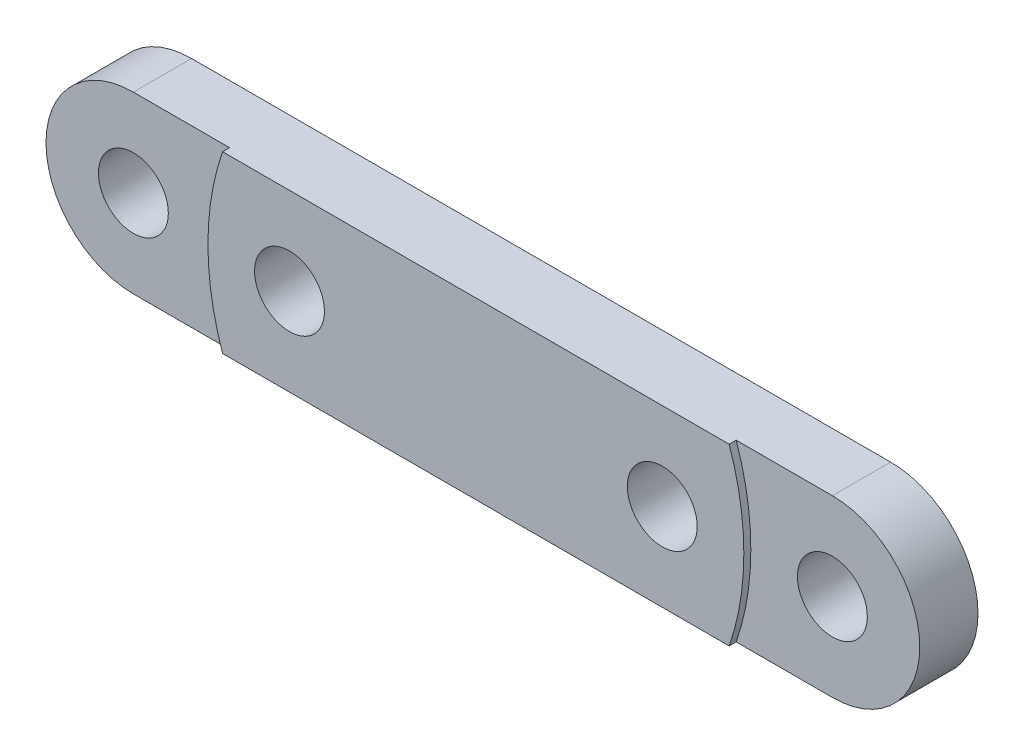
ISO-10303-21;
HEADER;
FILE_DESCRIPTION(('STEP AP214'),'2;1');
FILE_NAME('part.step','',(''),(''),'','','');
FILE_SCHEMA(('AUTOMOTIVE_DESIGN { 1 0 10303 214 1 1 1 1 }'));
ENDSEC;
DATA;
#1=APPLICATION_CONTEXT('core data for automotive mechanical design processes');
#2=APPLICATION_PROTOCOL_DEFINITION('international standard','automotive_design',2000,#1);
#3=PRODUCT_CONTEXT('',#1,'mechanical');
#4=PRODUCT('Part','Part','',(#3));
#5=PRODUCT_RELATED_PRODUCT_CATEGORY('part','',(#4));
#6=PRODUCT_DEFINITION_FORMATION('','',#4);
#7=PRODUCT_DEFINITION_CONTEXT('part definition',#1,'design');
#8=PRODUCT_DEFINITION('design','',#6,#7);
#9=PRODUCT_DEFINITION_SHAPE('','',#8);
#10=(LENGTH_UNIT() NAMED_UNIT(*) SI_UNIT(.MILLI.,.METRE.));
#11=(NAMED_UNIT(*) PLANE_ANGLE_UNIT() SI_UNIT($,.RADIAN.));
#12=(NAMED_UNIT(*) SI_UNIT($,.STERADIAN.) SOLID_ANGLE_UNIT());
#13=UNCERTAINTY_MEASURE_WITH_UNIT(LENGTH_MEASURE(1.E-05),#10,'distance_accuracy_value','');
#14=(GEOMETRIC_REPRESENTATION_CONTEXT(3) GLOBAL_UNCERTAINTY_ASSIGNED_CONTEXT((#13)) GLOBAL_UNIT_ASSIGNED_CONTEXT((#10,
#11,#12)) REPRESENTATION_CONTEXT('',''));
#15=CARTESIAN_POINT('',(0.,0.,0.));
#16=DIRECTION('',(0.,0.,1.));
#17=DIRECTION('',(1.,0.,0.));
#18=AXIS2_PLACEMENT_3D('',#15,#16,#17);
#19=CARTESIAN_POINT('',(-15.,0.,2.5));
#20=DIRECTION('',(0.,0.,1.));
#21=DIRECTION('',(1.,0.,0.));
#22=AXIS2_PLACEMENT_3D('',#19,#20,#21);
#23=PLANE('',#22);
#24=CARTESIAN_POINT('',(0.,0.,2.5));
#25=DIRECTION('',(0.,0.,1.));
#26=DIRECTION('',(1.,0.,0.));
#27=AXIS2_PLACEMENT_3D('',#24,#25,#26);
#28=CIRCLE('',#27,11.5);
#29=CARTESIAN_POINT('',(-10.8714074525794,3.75000000000014,2.5));
#30=VERTEX_POINT('',#29);
#31=CARTESIAN_POINT('',(-10.8714074525794,-3.75000000000014,2.5));
#32=VERTEX_POINT('',#31);
#33=EDGE_CURVE('E50',#30,#32,#28,.T.);
#34=ORIENTED_EDGE('',*,*,#33,.F.);
#35=DIRECTION('',(-1.,0.,0.));
#36=VECTOR('',#35,1.);
#37=CARTESIAN_POINT('',(-15.0000000000002,3.75000000000014,2.5));
#38=LINE('',#37,#36);
#39=CARTESIAN_POINT('',(-15.0000000000002,3.75000000000014,2.5));
#40=VERTEX_POINT('',#39);
#41=EDGE_CURVE('E155',#30,#40,#38,.T.);
#42=ORIENTED_EDGE('',*,*,#41,.T.);
#43=CARTESIAN_POINT('',(-15.,0.,2.5));
#44=DIRECTION('',(0.,0.,1.));
#45=DIRECTION('',(1.,0.,0.));
#46=AXIS2_PLACEMENT_3D('',#43,#44,#45);
#47=CIRCLE('',#46,3.75000000000014);
#48=CARTESIAN_POINT('',(-15.0000000000002,-3.75000000000014,2.5));
#49=VERTEX_POINT('',#48);
#50=EDGE_CURVE('E146',#40,#49,#47,.T.);
#51=ORIENTED_EDGE('',*,*,#50,.T.);
#52=DIRECTION('',(1.,0.,0.));
#53=VECTOR('',#52,1.);
#54=CARTESIAN_POINT('',(-15.0000000000002,-3.75000000000014,2.5));
#55=LINE('',#54,#53);
#56=EDGE_CURVE('E151',#49,#32,#55,.T.);
#57=ORIENTED_EDGE('',*,*,#56,.T.);
#58=EDGE_LOOP('',(#34,#42,#51,#57));
#59=FACE_BOUND('',#58,.T.);
#60=CARTESIAN_POINT('',(-15.,0.,2.5));
#61=DIRECTION('',(0.,0.,1.));
#62=DIRECTION('',(1.,0.,0.));
#63=AXIS2_PLACEMENT_3D('',#60,#61,#62);
#64=CIRCLE('',#63,1.5);
#65=CARTESIAN_POINT('',(-13.5,0.,2.5));
#66=VERTEX_POINT('',#65);
#67=EDGE_CURVE('E140',#66,#66,#64,.T.);
#68=ORIENTED_EDGE('',*,*,#67,.F.);
#69=EDGE_LOOP('',(#68));
#70=FACE_BOUND('',#69,.T.);
#71=ADVANCED_FACE('F35',(#59,#70),#23,.T.);
#72=CARTESIAN_POINT('',(0.,0.,2.5));
#73=DIRECTION('',(0.,0.,1.));
#74=DIRECTION('',(1.,0.,0.));
#75=AXIS2_PLACEMENT_3D('',#72,#73,#74);
#76=CIRCLE('',#75,11.5);
#77=CARTESIAN_POINT('',(10.8714074525794,-3.75000000000014,2.5));
#78=VERTEX_POINT('',#77);
#79=CARTESIAN_POINT('',(10.8714074525794,3.75000000000014,2.5));
#80=VERTEX_POINT('',#79);
#81=EDGE_CURVE('E58',#78,#80,#76,.T.);
#82=ORIENTED_EDGE('',*,*,#81,.F.);
#83=CARTESIAN_POINT('',(14.9999999999998,-3.75000000000014,2.5));
#84=VERTEX_POINT('',#83);
#85=EDGE_CURVE('E149',#78,#84,#55,.T.);
#86=ORIENTED_EDGE('',*,*,#85,.T.);
#87=CARTESIAN_POINT('',(15.,0.,2.5));
#88=DIRECTION('',(0.,0.,1.));
#89=DIRECTION('',(1.,0.,0.));
#90=AXIS2_PLACEMENT_3D('',#87,#88,#89);
#91=CIRCLE('',#90,3.75000000000014);
#92=CARTESIAN_POINT('',(14.9999999999998,3.75000000000014,2.5));
#93=VERTEX_POINT('',#92);
#94=EDGE_CURVE('E153',#84,#93,#91,.T.);
#95=ORIENTED_EDGE('',*,*,#94,.T.);
#96=EDGE_CURVE('E156',#93,#80,#38,.T.);
#97=ORIENTED_EDGE('',*,*,#96,.T.);
#98=EDGE_LOOP('',(#82,#86,#95,#97));
#99=FACE_BOUND('',#98,.T.);
#100=CARTESIAN_POINT('',(15.,0.,2.5));
#101=DIRECTION('',(0.,0.,1.));
#102=DIRECTION('',(1.,0.,0.));
#103=AXIS2_PLACEMENT_3D('',#100,#101,#102);
#104=CIRCLE('',#103,1.5);
#105=CARTESIAN_POINT('',(16.5,0.,2.5));
#106=VERTEX_POINT('',#105);
#107=EDGE_CURVE('E134',#106,#106,#104,.T.);
#108=ORIENTED_EDGE('',*,*,#107,.F.);
#109=EDGE_LOOP('',(#108));
#110=FACE_BOUND('',#109,.T.);
#111=ADVANCED_FACE('F206',(#99,#110),#23,.T.);
#112=CARTESIAN_POINT('',(-15.,0.,0.));
#113=DIRECTION('',(0.,0.,1.));
#114=DIRECTION('',(1.,0.,0.));
#115=AXIS2_PLACEMENT_3D('',#112,#113,#114);
#116=PLANE('',#115);
#117=CARTESIAN_POINT('',(-15.,0.,0.));
#118=DIRECTION('',(0.,0.,1.));
#119=DIRECTION('',(1.,0.,0.));
#120=AXIS2_PLACEMENT_3D('',#117,#118,#119);
#121=CIRCLE('',#120,3.75000000000014);
#122=CARTESIAN_POINT('',(-15.0000000000002,3.75000000000014,0.));
#123=VERTEX_POINT('',#122);
#124=CARTESIAN_POINT('',(-15.0000000000002,-3.75000000000014,0.));
#125=VERTEX_POINT('',#124);
#126=EDGE_CURVE('E143',#123,#125,#121,.T.);
#127=ORIENTED_EDGE('',*,*,#126,.F.);
#128=DIRECTION('',(-1.,0.,0.));
#129=VECTOR('',#128,1.);
#130=CARTESIAN_POINT('',(-15.0000000000002,3.75000000000014,0.));
#131=LINE('',#130,#129);
#132=CARTESIAN_POINT('',(14.9999999999998,3.75000000000014,0.));
#133=VERTEX_POINT('',#132);
#134=EDGE_CURVE('E150',#133,#123,#131,.T.);
#135=ORIENTED_EDGE('',*,*,#134,.F.);
#136=CARTESIAN_POINT('',(15.,0.,0.));
#137=DIRECTION('',(0.,0.,1.));
#138=DIRECTION('',(1.,0.,0.));
#139=AXIS2_PLACEMENT_3D('',#136,#137,#138);
#140=CIRCLE('',#139,3.75000000000014);
#141=CARTESIAN_POINT('',(14.9999999999998,-3.75000000000014,0.));
#142=VERTEX_POINT('',#141);
#143=EDGE_CURVE('E163',#142,#133,#140,.T.);
#144=ORIENTED_EDGE('',*,*,#143,.F.);
#145=DIRECTION('',(1.,0.,0.));
#146=VECTOR('',#145,1.);
#147=CARTESIAN_POINT('',(-15.0000000000002,-3.75000000000014,0.));
#148=LINE('',#147,#146);
#149=EDGE_CURVE('E161',#125,#142,#148,.T.);
#150=ORIENTED_EDGE('',*,*,#149,.F.);
#151=EDGE_LOOP('',(#127,#135,#144,#150));
#152=FACE_BOUND('',#151,.T.);
#153=CARTESIAN_POINT('',(-15.,0.,0.));
#154=DIRECTION('',(0.,0.,1.));
#155=DIRECTION('',(1.,0.,0.));
#156=AXIS2_PLACEMENT_3D('',#153,#154,#155);
#157=CIRCLE('',#156,1.5);
#158=CARTESIAN_POINT('',(-13.5,0.,0.));
#159=VERTEX_POINT('',#158);
#160=EDGE_CURVE('E137',#159,#159,#157,.T.);
#161=ORIENTED_EDGE('',*,*,#160,.T.);
#162=EDGE_LOOP('',(#161));
#163=FACE_BOUND('',#162,.T.);
#164=CARTESIAN_POINT('',(15.,0.,0.));
#165=DIRECTION('',(0.,0.,1.));
#166=DIRECTION('',(1.,0.,0.));
#167=AXIS2_PLACEMENT_3D('',#164,#165,#166);
#168=CIRCLE('',#167,1.5);
#169=CARTESIAN_POINT('',(16.5,0.,0.));
#170=VERTEX_POINT('',#169);
#171=EDGE_CURVE('E133',#170,#170,#168,.T.);
#172=ORIENTED_EDGE('',*,*,#171,.T.);
#173=EDGE_LOOP('',(#172));
#174=FACE_BOUND('',#173,.T.);
#175=CARTESIAN_POINT('',(-8.00000000000001,0.,0.));
#176=DIRECTION('',(0.,0.,1.));
#177=DIRECTION('',(1.,0.,0.));
#178=AXIS2_PLACEMENT_3D('',#175,#176,#177);
#179=CIRCLE('',#178,1.50000000000006);
#180=CARTESIAN_POINT('',(-6.49999999999995,0.,0.));
#181=VERTEX_POINT('',#180);
#182=EDGE_CURVE('E125',#181,#181,#179,.T.);
#183=ORIENTED_EDGE('',*,*,#182,.T.);
#184=EDGE_LOOP('',(#183));
#185=FACE_BOUND('',#184,.T.);
#186=CARTESIAN_POINT('',(8.,0.,0.));
#187=DIRECTION('',(0.,0.,1.));
#188=DIRECTION('',(1.,0.,0.));
#189=AXIS2_PLACEMENT_3D('',#186,#187,#188);
#190=CIRCLE('',#189,1.49999999999921);
#191=CARTESIAN_POINT('',(9.49999999999921,0.,0.));
#192=VERTEX_POINT('',#191);
#193=EDGE_CURVE('E122',#192,#192,#190,.T.);
#194=ORIENTED_EDGE('',*,*,#193,.T.);
#195=EDGE_LOOP('',(#194));
#196=FACE_BOUND('',#195,.T.);
#197=ADVANCED_FACE('F180',(#152,#163,#174,#185,#196),#116,.F.);
#198=CARTESIAN_POINT('',(-15.,0.,2.5));
#199=DIRECTION('',(0.,0.,-1.));
#200=DIRECTION('',(-1.,0.,0.));
#201=AXIS2_PLACEMENT_3D('',#198,#199,#200);
#202=CYLINDRICAL_SURFACE('',#201,3.75000000000014);
#203=ORIENTED_EDGE('',*,*,#126,.T.);
#204=DIRECTION('',(0.,0.,-1.));
#205=VECTOR('',#204,1.);
#206=CARTESIAN_POINT('',(-15.0000000000002,-3.75000000000014,2.5));
#207=LINE('',#206,#205);
#208=EDGE_CURVE('E11',#49,#125,#207,.T.);
#209=ORIENTED_EDGE('',*,*,#208,.F.);
#210=ORIENTED_EDGE('',*,*,#50,.F.);
#211=DIRECTION('',(0.,0.,-1.));
#212=VECTOR('',#211,1.);
#213=CARTESIAN_POINT('',(-15.0000000000002,3.75000000000014,2.5));
#214=LINE('',#213,#212);
#215=EDGE_CURVE('E158',#40,#123,#214,.T.);
#216=ORIENTED_EDGE('',*,*,#215,.T.);
#217=EDGE_LOOP('',(#203,#209,#210,#216));
#218=FACE_BOUND('',#217,.T.);
#219=ADVANCED_FACE('F37',(#218),#202,.T.);
#220=CARTESIAN_POINT('',(-15.0000000000002,-3.75000000000014,2.5));
#221=DIRECTION('',(0.,1.,0.));
#222=DIRECTION('',(0.,0.,1.));
#223=AXIS2_PLACEMENT_3D('',#220,#221,#222);
#224=PLANE('',#223);
#225=ORIENTED_EDGE('',*,*,#149,.T.);
#226=DIRECTION('',(0.,0.,-1.));
#227=VECTOR('',#226,1.);
#228=CARTESIAN_POINT('',(14.9999999999998,-3.75000000000014,2.5));
#229=LINE('',#228,#227);
#230=EDGE_CURVE('E43',#84,#142,#229,.T.);
#231=ORIENTED_EDGE('',*,*,#230,.F.);
#232=ORIENTED_EDGE('',*,*,#85,.F.);
#233=DIRECTION('',(0.,0.,-1.));
#234=VECTOR('',#233,1.);
#235=CARTESIAN_POINT('',(10.8714074525794,-3.75000000000014,2.8));
#236=LINE('',#235,#234);
#237=CARTESIAN_POINT('',(10.8714074525794,-3.75000000000014,2.8));
#238=VERTEX_POINT('',#237);
#239=EDGE_CURVE('E106',#238,#78,#236,.T.);
#240=ORIENTED_EDGE('',*,*,#239,.F.);
#241=DIRECTION('',(1.,0.,0.));
#242=VECTOR('',#241,1.);
#243=CARTESIAN_POINT('',(0.,-3.75000000000014,2.8));
#244=LINE('',#243,#242);
#245=CARTESIAN_POINT('',(-10.8714074525794,-3.75000000000014,2.8));
#246=VERTEX_POINT('',#245);
#247=EDGE_CURVE('E100',#246,#238,#244,.T.);
#248=ORIENTED_EDGE('',*,*,#247,.F.);
#249=DIRECTION('',(0.,0.,-1.));
#250=VECTOR('',#249,1.);
#251=CARTESIAN_POINT('',(-10.8714074525794,-3.75000000000014,2.8));
#252=LINE('',#251,#250);
#253=EDGE_CURVE('E104',#246,#32,#252,.T.);
#254=ORIENTED_EDGE('',*,*,#253,.T.);
#255=ORIENTED_EDGE('',*,*,#56,.F.);
#256=ORIENTED_EDGE('',*,*,#208,.T.);
#257=EDGE_LOOP('',(#225,#231,#232,#240,#248,#254,#255,#256));
#258=FACE_BOUND('',#257,.T.);
#259=ADVANCED_FACE('F102',(#258),#224,.F.);
#260=CARTESIAN_POINT('',(15.,0.,2.5));
#261=DIRECTION('',(0.,0.,-1.));
#262=DIRECTION('',(-1.,0.,0.));
#263=AXIS2_PLACEMENT_3D('',#260,#261,#262);
#264=CYLINDRICAL_SURFACE('',#263,3.75000000000014);
#265=ORIENTED_EDGE('',*,*,#143,.T.);
#266=DIRECTION('',(0.,0.,-1.));
#267=VECTOR('',#266,1.);
#268=CARTESIAN_POINT('',(14.9999999999998,3.75000000000014,2.5));
#269=LINE('',#268,#267);
#270=EDGE_CURVE('E168',#93,#133,#269,.T.);
#271=ORIENTED_EDGE('',*,*,#270,.F.);
#272=ORIENTED_EDGE('',*,*,#94,.F.);
#273=ORIENTED_EDGE('',*,*,#230,.T.);
#274=EDGE_LOOP('',(#265,#271,#272,#273));
#275=FACE_BOUND('',#274,.T.);
#276=ADVANCED_FACE('F175',(#275),#264,.T.);
#277=CARTESIAN_POINT('',(-15.0000000000002,3.75000000000014,2.5));
#278=DIRECTION('',(0.,-1.,0.));
#279=DIRECTION('',(0.,0.,-1.));
#280=AXIS2_PLACEMENT_3D('',#277,#278,#279);
#281=PLANE('',#280);
#282=ORIENTED_EDGE('',*,*,#134,.T.);
#283=ORIENTED_EDGE('',*,*,#215,.F.);
#284=ORIENTED_EDGE('',*,*,#41,.F.);
#285=DIRECTION('',(0.,0.,-1.));
#286=VECTOR('',#285,1.);
#287=CARTESIAN_POINT('',(-10.8714074525794,3.75000000000014,2.8));
#288=LINE('',#287,#286);
#289=CARTESIAN_POINT('',(-10.8714074525794,3.75000000000014,2.8));
#290=VERTEX_POINT('',#289);
#291=EDGE_CURVE('E190',#290,#30,#288,.T.);
#292=ORIENTED_EDGE('',*,*,#291,.F.);
#293=DIRECTION('',(-1.,0.,0.));
#294=VECTOR('',#293,1.);
#295=CARTESIAN_POINT('',(0.,3.75000000000014,2.8));
#296=LINE('',#295,#294);
#297=CARTESIAN_POINT('',(10.8714074525794,3.75000000000014,2.8));
#298=VERTEX_POINT('',#297);
#299=EDGE_CURVE('E116',#298,#290,#296,.T.);
#300=ORIENTED_EDGE('',*,*,#299,.F.);
#301=DIRECTION('',(0.,0.,-1.));
#302=VECTOR('',#301,1.);
#303=CARTESIAN_POINT('',(10.8714074525794,3.75000000000014,2.8));
#304=LINE('',#303,#302);
#305=EDGE_CURVE('E127',#298,#80,#304,.T.);
#306=ORIENTED_EDGE('',*,*,#305,.T.);
#307=ORIENTED_EDGE('',*,*,#96,.F.);
#308=ORIENTED_EDGE('',*,*,#270,.T.);
#309=EDGE_LOOP('',(#282,#283,#284,#292,#300,#306,#307,#308));
#310=FACE_BOUND('',#309,.T.);
#311=ADVANCED_FACE('F184',(#310),#281,.F.);
#312=CARTESIAN_POINT('',(-15.,0.,2.5));
#313=DIRECTION('',(0.,0.,-1.));
#314=DIRECTION('',(-1.,0.,0.));
#315=AXIS2_PLACEMENT_3D('',#312,#313,#314);
#316=CYLINDRICAL_SURFACE('',#315,1.5);
#317=ORIENTED_EDGE('',*,*,#67,.T.);
#318=EDGE_LOOP('',(#317));
#319=FACE_BOUND('',#318,.T.);
#320=ORIENTED_EDGE('',*,*,#160,.F.);
#321=EDGE_LOOP('',(#320));
#322=FACE_BOUND('',#321,.T.);
#323=ADVANCED_FACE('F216',(#319,#322),#316,.F.);
#324=CARTESIAN_POINT('',(15.,0.,2.5));
#325=DIRECTION('',(0.,0.,-1.));
#326=DIRECTION('',(-1.,0.,0.));
#327=AXIS2_PLACEMENT_3D('',#324,#325,#326);
#328=CYLINDRICAL_SURFACE('',#327,1.5);
#329=ORIENTED_EDGE('',*,*,#107,.T.);
#330=EDGE_LOOP('',(#329));
#331=FACE_BOUND('',#330,.T.);
#332=ORIENTED_EDGE('',*,*,#171,.F.);
#333=EDGE_LOOP('',(#332));
#334=FACE_BOUND('',#333,.T.);
#335=ADVANCED_FACE('F212',(#331,#334),#328,.F.);
#336=CARTESIAN_POINT('',(-8.00000000000001,0.,2.5));
#337=DIRECTION('',(0.,0.,-1.));
#338=DIRECTION('',(-1.,0.,0.));
#339=AXIS2_PLACEMENT_3D('',#336,#337,#338);
#340=CYLINDRICAL_SURFACE('',#339,1.50000000000006);
#341=ORIENTED_EDGE('',*,*,#182,.F.);
#342=EDGE_LOOP('',(#341));
#343=FACE_BOUND('',#342,.T.);
#344=CARTESIAN_POINT('',(-8.00000000000001,0.,2.8));
#345=DIRECTION('',(0.,0.,1.));
#346=DIRECTION('',(1.,0.,0.));
#347=AXIS2_PLACEMENT_3D('',#344,#345,#346);
#348=CIRCLE('',#347,1.50000000000006);
#349=CARTESIAN_POINT('',(-6.49999999999995,0.,2.8));
#350=VERTEX_POINT('',#349);
#351=EDGE_CURVE('E195',#350,#350,#348,.F.);
#352=ORIENTED_EDGE('',*,*,#351,.F.);
#353=EDGE_LOOP('',(#352));
#354=FACE_BOUND('',#353,.T.);
#355=ADVANCED_FACE('F215',(#343,#354),#340,.F.);
#356=CARTESIAN_POINT('',(8.,0.,2.5));
#357=DIRECTION('',(0.,0.,-1.));
#358=DIRECTION('',(-1.,0.,0.));
#359=AXIS2_PLACEMENT_3D('',#356,#357,#358);
#360=CYLINDRICAL_SURFACE('',#359,1.49999999999921);
#361=ORIENTED_EDGE('',*,*,#193,.F.);
#362=EDGE_LOOP('',(#361));
#363=FACE_BOUND('',#362,.T.);
#364=CARTESIAN_POINT('',(8.,0.,2.8));
#365=DIRECTION('',(0.,0.,1.));
#366=DIRECTION('',(1.,0.,0.));
#367=AXIS2_PLACEMENT_3D('',#364,#365,#366);
#368=CIRCLE('',#367,1.49999999999921);
#369=CARTESIAN_POINT('',(9.49999999999921,0.,2.8));
#370=VERTEX_POINT('',#369);
#371=EDGE_CURVE('E191',#370,#370,#368,.F.);
#372=ORIENTED_EDGE('',*,*,#371,.F.);
#373=EDGE_LOOP('',(#372));
#374=FACE_BOUND('',#373,.T.);
#375=ADVANCED_FACE('F227',(#363,#374),#360,.F.);
#376=CARTESIAN_POINT('',(0.,0.,2.8));
#377=DIRECTION('',(0.,0.,-1.));
#378=DIRECTION('',(-1.,0.,0.));
#379=AXIS2_PLACEMENT_3D('',#376,#377,#378);
#380=CYLINDRICAL_SURFACE('',#379,11.5);
#381=ORIENTED_EDGE('',*,*,#33,.T.);
#382=ORIENTED_EDGE('',*,*,#253,.F.);
#383=CARTESIAN_POINT('',(0.,0.,2.8));
#384=DIRECTION('',(0.,0.,1.));
#385=DIRECTION('',(1.,0.,0.));
#386=AXIS2_PLACEMENT_3D('',#383,#384,#385);
#387=CIRCLE('',#386,11.5);
#388=EDGE_CURVE('E110',#290,#246,#387,.T.);
#389=ORIENTED_EDGE('',*,*,#388,.F.);
#390=ORIENTED_EDGE('',*,*,#291,.T.);
#391=EDGE_LOOP('',(#381,#382,#389,#390));
#392=FACE_BOUND('',#391,.T.);
#393=ADVANCED_FACE('F121',(#392),#380,.T.);
#394=CARTESIAN_POINT('',(0.,0.,2.8));
#395=DIRECTION('',(0.,0.,-1.));
#396=DIRECTION('',(-1.,0.,0.));
#397=AXIS2_PLACEMENT_3D('',#394,#395,#396);
#398=CYLINDRICAL_SURFACE('',#397,11.5);
#399=ORIENTED_EDGE('',*,*,#81,.T.);
#400=ORIENTED_EDGE('',*,*,#305,.F.);
#401=CARTESIAN_POINT('',(0.,0.,2.8));
#402=DIRECTION('',(0.,0.,1.));
#403=DIRECTION('',(1.,0.,0.));
#404=AXIS2_PLACEMENT_3D('',#401,#402,#403);
#405=CIRCLE('',#404,11.5);
#406=EDGE_CURVE('E109',#238,#298,#405,.T.);
#407=ORIENTED_EDGE('',*,*,#406,.F.);
#408=ORIENTED_EDGE('',*,*,#239,.T.);
#409=EDGE_LOOP('',(#399,#400,#407,#408));
#410=FACE_BOUND('',#409,.T.);
#411=ADVANCED_FACE('F205',(#410),#398,.T.);
#412=CARTESIAN_POINT('',(0.,0.,2.8));
#413=DIRECTION('',(0.,0.,1.));
#414=DIRECTION('',(1.,0.,0.));
#415=AXIS2_PLACEMENT_3D('',#412,#413,#414);
#416=PLANE('',#415);
#417=ORIENTED_EDGE('',*,*,#388,.T.);
#418=ORIENTED_EDGE('',*,*,#247,.T.);
#419=ORIENTED_EDGE('',*,*,#406,.T.);
#420=ORIENTED_EDGE('',*,*,#299,.T.);
#421=EDGE_LOOP('',(#417,#418,#419,#420));
#422=FACE_BOUND('',#421,.T.);
#423=ORIENTED_EDGE('',*,*,#351,.T.);
#424=EDGE_LOOP('',(#423));
#425=FACE_BOUND('',#424,.T.);
#426=ORIENTED_EDGE('',*,*,#371,.T.);
#427=EDGE_LOOP('',(#426));
#428=FACE_BOUND('',#427,.T.);
#429=ADVANCED_FACE('F113',(#422,#425,#428),#416,.T.);
#430=CLOSED_SHELL('',(#71,#111,#197,#219,#259,#276,#311,#323,#335,#355,#375,#393,#411,#429));
#431=MANIFOLD_SOLID_BREP('B2',#430);
#432=ADVANCED_BREP_SHAPE_REPRESENTATION('',(#18,#431),#14);
#433=SHAPE_DEFINITION_REPRESENTATION(#9,#432);
ENDSEC;
END-ISO-10303-21;
